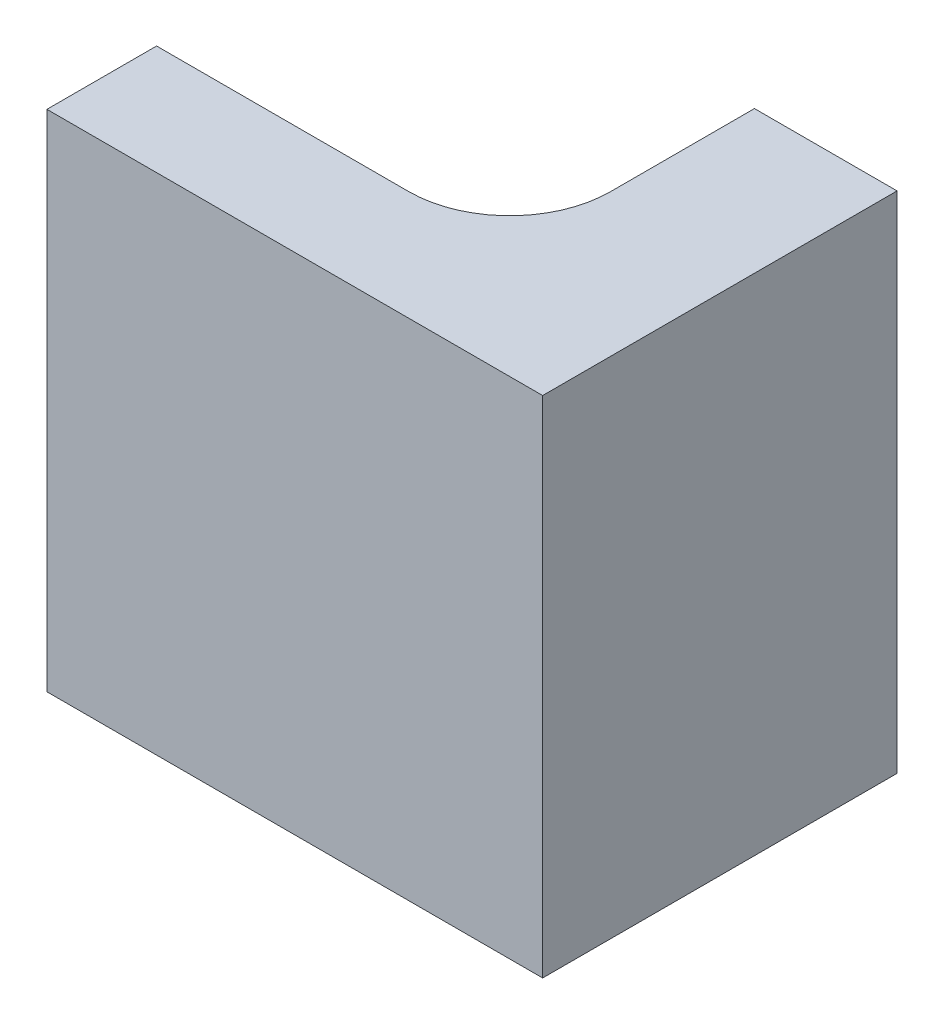
ISO-10303-21;
HEADER;
FILE_DESCRIPTION(('STEP AP214'),'2;1');
FILE_NAME('part.step','',(''),(''),'','','');
FILE_SCHEMA(('AUTOMOTIVE_DESIGN { 1 0 10303 214 1 1 1 1 }'));
ENDSEC;
DATA;
#1=APPLICATION_CONTEXT('core data for automotive mechanical design processes');
#2=APPLICATION_PROTOCOL_DEFINITION('international standard','automotive_design',2000,#1);
#3=PRODUCT_CONTEXT('',#1,'mechanical');
#4=PRODUCT('Part','Part','',(#3));
#5=PRODUCT_RELATED_PRODUCT_CATEGORY('part','',(#4));
#6=PRODUCT_DEFINITION_FORMATION('','',#4);
#7=PRODUCT_DEFINITION_CONTEXT('part definition',#1,'design');
#8=PRODUCT_DEFINITION('design','',#6,#7);
#9=PRODUCT_DEFINITION_SHAPE('','',#8);
#10=(LENGTH_UNIT() NAMED_UNIT(*) SI_UNIT(.MILLI.,.METRE.));
#11=(NAMED_UNIT(*) PLANE_ANGLE_UNIT() SI_UNIT($,.RADIAN.));
#12=(NAMED_UNIT(*) SI_UNIT($,.STERADIAN.) SOLID_ANGLE_UNIT());
#13=UNCERTAINTY_MEASURE_WITH_UNIT(LENGTH_MEASURE(1.E-05),#10,'distance_accuracy_value','');
#14=(GEOMETRIC_REPRESENTATION_CONTEXT(3) GLOBAL_UNCERTAINTY_ASSIGNED_CONTEXT((#13)) GLOBAL_UNIT_ASSIGNED_CONTEXT((#10,
#11,#12)) REPRESENTATION_CONTEXT('',''));
#15=CARTESIAN_POINT('',(0.,0.,0.));
#16=DIRECTION('',(0.,0.,1.));
#17=DIRECTION('',(1.,0.,0.));
#18=AXIS2_PLACEMENT_3D('',#15,#16,#17);
#19=CARTESIAN_POINT('',(0.,50.,-10.8698932293332));
#20=DIRECTION('',(1.,0.,0.));
#21=DIRECTION('',(0.,0.,-1.));
#22=AXIS2_PLACEMENT_3D('',#19,#20,#21);
#23=PLANE('',#22);
#24=DIRECTION('',(0.,0.,1.));
#25=VECTOR('',#24,1.);
#26=CARTESIAN_POINT('',(0.,0.,-10.8698932293332));
#27=LINE('',#26,#25);
#28=CARTESIAN_POINT('',(0.,0.,-10.8698932293332));
#29=VERTEX_POINT('',#28);
#30=CARTESIAN_POINT('',(0.,0.,0.));
#31=VERTEX_POINT('',#30);
#32=EDGE_CURVE('E122',#29,#31,#27,.T.);
#33=ORIENTED_EDGE('',*,*,#32,.T.);
#34=DIRECTION('',(0.,-1.,0.));
#35=VECTOR('',#34,1.);
#36=CARTESIAN_POINT('',(0.,50.,0.));
#37=LINE('',#36,#35);
#38=CARTESIAN_POINT('',(0.,50.,0.));
#39=VERTEX_POINT('',#38);
#40=EDGE_CURVE('E102',#39,#31,#37,.T.);
#41=ORIENTED_EDGE('',*,*,#40,.F.);
#42=DIRECTION('',(0.,0.,1.));
#43=VECTOR('',#42,1.);
#44=CARTESIAN_POINT('',(0.,50.,-10.8698932293332));
#45=LINE('',#44,#43);
#46=CARTESIAN_POINT('',(0.,50.,-10.8698932293332));
#47=VERTEX_POINT('',#46);
#48=EDGE_CURVE('E112',#47,#39,#45,.T.);
#49=ORIENTED_EDGE('',*,*,#48,.F.);
#50=DIRECTION('',(0.,-1.,0.));
#51=VECTOR('',#50,1.);
#52=CARTESIAN_POINT('',(0.,50.,-10.8698932293332));
#53=LINE('',#52,#51);
#54=EDGE_CURVE('E140',#47,#29,#53,.T.);
#55=ORIENTED_EDGE('',*,*,#54,.T.);
#56=EDGE_LOOP('',(#33,#41,#49,#55));
#57=FACE_BOUND('',#56,.T.);
#58=ADVANCED_FACE('F41',(#57),#23,.F.);
#59=CARTESIAN_POINT('',(0.,50.,0.));
#60=DIRECTION('',(0.,0.,-1.));
#61=DIRECTION('',(-1.,0.,0.));
#62=AXIS2_PLACEMENT_3D('',#59,#60,#61);
#63=PLANE('',#62);
#64=DIRECTION('',(1.,0.,0.));
#65=VECTOR('',#64,1.);
#66=CARTESIAN_POINT('',(0.,0.,0.));
#67=LINE('',#66,#65);
#68=CARTESIAN_POINT('',(49.1370117000192,0.,0.));
#69=VERTEX_POINT('',#68);
#70=EDGE_CURVE('E148',#31,#69,#67,.T.);
#71=ORIENTED_EDGE('',*,*,#70,.T.);
#72=DIRECTION('',(0.,-1.,0.));
#73=VECTOR('',#72,1.);
#74=CARTESIAN_POINT('',(49.1370117000192,50.,0.));
#75=LINE('',#74,#73);
#76=CARTESIAN_POINT('',(49.1370117000192,50.,0.));
#77=VERTEX_POINT('',#76);
#78=EDGE_CURVE('E110',#77,#69,#75,.T.);
#79=ORIENTED_EDGE('',*,*,#78,.F.);
#80=DIRECTION('',(1.,0.,0.));
#81=VECTOR('',#80,1.);
#82=CARTESIAN_POINT('',(0.,50.,0.));
#83=LINE('',#82,#81);
#84=EDGE_CURVE('E99',#39,#77,#83,.T.);
#85=ORIENTED_EDGE('',*,*,#84,.F.);
#86=ORIENTED_EDGE('',*,*,#40,.T.);
#87=EDGE_LOOP('',(#71,#79,#85,#86));
#88=FACE_BOUND('',#87,.T.);
#89=ADVANCED_FACE('F105',(#88),#63,.F.);
#90=CARTESIAN_POINT('',(49.1370117000192,50.,0.));
#91=DIRECTION('',(-1.,0.,0.));
#92=DIRECTION('',(0.,0.,1.));
#93=AXIS2_PLACEMENT_3D('',#90,#91,#92);
#94=PLANE('',#93);
#95=DIRECTION('',(0.,0.,-1.));
#96=VECTOR('',#95,1.);
#97=CARTESIAN_POINT('',(49.1370117000192,0.,0.));
#98=LINE('',#97,#96);
#99=CARTESIAN_POINT('',(49.1370117000192,0.,-35.1302346397289));
#100=VERTEX_POINT('',#99);
#101=EDGE_CURVE('E145',#69,#100,#98,.T.);
#102=ORIENTED_EDGE('',*,*,#101,.T.);
#103=DIRECTION('',(0.,-1.,0.));
#104=VECTOR('',#103,1.);
#105=CARTESIAN_POINT('',(49.1370117000192,50.,-35.1302346397289));
#106=LINE('',#105,#104);
#107=CARTESIAN_POINT('',(49.1370117000192,50.,-35.1302346397289));
#108=VERTEX_POINT('',#107);
#109=EDGE_CURVE('E126',#108,#100,#106,.T.);
#110=ORIENTED_EDGE('',*,*,#109,.F.);
#111=DIRECTION('',(0.,0.,-1.));
#112=VECTOR('',#111,1.);
#113=CARTESIAN_POINT('',(49.1370117000192,50.,0.));
#114=LINE('',#113,#112);
#115=EDGE_CURVE('E109',#77,#108,#114,.T.);
#116=ORIENTED_EDGE('',*,*,#115,.F.);
#117=ORIENTED_EDGE('',*,*,#78,.T.);
#118=EDGE_LOOP('',(#102,#110,#116,#117));
#119=FACE_BOUND('',#118,.T.);
#120=ADVANCED_FACE('F158',(#119),#94,.F.);
#121=CARTESIAN_POINT('',(49.1370117000192,50.,-35.1302346397289));
#122=DIRECTION('',(0.,0.,1.));
#123=DIRECTION('',(1.,0.,0.));
#124=AXIS2_PLACEMENT_3D('',#121,#122,#123);
#125=PLANE('',#124);
#126=DIRECTION('',(-1.,0.,0.));
#127=VECTOR('',#126,1.);
#128=CARTESIAN_POINT('',(49.1370117000192,0.,-35.1302346397289));
#129=LINE('',#128,#127);
#130=CARTESIAN_POINT('',(35.,0.,-35.1302346397289));
#131=VERTEX_POINT('',#130);
#132=EDGE_CURVE('E142',#100,#131,#129,.T.);
#133=ORIENTED_EDGE('',*,*,#132,.T.);
#134=DIRECTION('',(0.,-1.,0.));
#135=VECTOR('',#134,1.);
#136=CARTESIAN_POINT('',(35.,50.,-35.1302346397289));
#137=LINE('',#136,#135);
#138=CARTESIAN_POINT('',(35.,50.,-35.1302346397289));
#139=VERTEX_POINT('',#138);
#140=EDGE_CURVE('E131',#139,#131,#137,.T.);
#141=ORIENTED_EDGE('',*,*,#140,.F.);
#142=DIRECTION('',(-1.,0.,0.));
#143=VECTOR('',#142,1.);
#144=CARTESIAN_POINT('',(49.1370117000192,50.,-35.1302346397289));
#145=LINE('',#144,#143);
#146=EDGE_CURVE('E155',#108,#139,#145,.T.);
#147=ORIENTED_EDGE('',*,*,#146,.F.);
#148=ORIENTED_EDGE('',*,*,#109,.T.);
#149=EDGE_LOOP('',(#133,#141,#147,#148));
#150=FACE_BOUND('',#149,.T.);
#151=ADVANCED_FACE('F165',(#150),#125,.F.);
#152=CARTESIAN_POINT('',(35.,50.,-35.1302346397289));
#153=DIRECTION('',(1.,0.,0.));
#154=DIRECTION('',(0.,0.,-1.));
#155=AXIS2_PLACEMENT_3D('',#152,#153,#154);
#156=PLANE('',#155);
#157=DIRECTION('',(0.,0.,1.));
#158=VECTOR('',#157,1.);
#159=CARTESIAN_POINT('',(35.,0.,-35.1302346397289));
#160=LINE('',#159,#158);
#161=CARTESIAN_POINT('',(35.,0.,-20.8698932293332));
#162=VERTEX_POINT('',#161);
#163=EDGE_CURVE('E139',#131,#162,#160,.T.);
#164=ORIENTED_EDGE('',*,*,#163,.T.);
#165=DIRECTION('',(0.,-1.,0.));
#166=VECTOR('',#165,1.);
#167=CARTESIAN_POINT('',(35.,50.,-20.8698932293332));
#168=LINE('',#167,#166);
#169=CARTESIAN_POINT('',(35.,50.,-20.8698932293332));
#170=VERTEX_POINT('',#169);
#171=EDGE_CURVE('E57',#162,#170,#168,.F.);
#172=ORIENTED_EDGE('',*,*,#171,.T.);
#173=DIRECTION('',(0.,0.,1.));
#174=VECTOR('',#173,1.);
#175=CARTESIAN_POINT('',(35.,50.,-35.1302346397289));
#176=LINE('',#175,#174);
#177=EDGE_CURVE('E147',#139,#170,#176,.T.);
#178=ORIENTED_EDGE('',*,*,#177,.F.);
#179=ORIENTED_EDGE('',*,*,#140,.T.);
#180=EDGE_LOOP('',(#164,#172,#178,#179));
#181=FACE_BOUND('',#180,.T.);
#182=ADVANCED_FACE('F162',(#181),#156,.F.);
#183=CARTESIAN_POINT('',(35.,50.,-10.8698932293332));
#184=DIRECTION('',(0.,0.,1.));
#185=DIRECTION('',(1.,0.,0.));
#186=AXIS2_PLACEMENT_3D('',#183,#184,#185);
#187=PLANE('',#186);
#188=DIRECTION('',(-1.,0.,0.));
#189=VECTOR('',#188,1.);
#190=CARTESIAN_POINT('',(35.,50.,-10.8698932293332));
#191=LINE('',#190,#189);
#192=CARTESIAN_POINT('',(25.,50.,-10.8698932293332));
#193=VERTEX_POINT('',#192);
#194=EDGE_CURVE('E117',#193,#47,#191,.T.);
#195=ORIENTED_EDGE('',*,*,#194,.F.);
#196=DIRECTION('',(0.,-1.,0.));
#197=VECTOR('',#196,1.);
#198=CARTESIAN_POINT('',(25.,0.,-10.8698932293332));
#199=LINE('',#198,#197);
#200=CARTESIAN_POINT('',(25.,0.,-10.8698932293332));
#201=VERTEX_POINT('',#200);
#202=EDGE_CURVE('E123',#193,#201,#199,.T.);
#203=ORIENTED_EDGE('',*,*,#202,.T.);
#204=DIRECTION('',(-1.,0.,0.));
#205=VECTOR('',#204,1.);
#206=CARTESIAN_POINT('',(35.,0.,-10.8698932293332));
#207=LINE('',#206,#205);
#208=EDGE_CURVE('E118',#201,#29,#207,.T.);
#209=ORIENTED_EDGE('',*,*,#208,.T.);
#210=ORIENTED_EDGE('',*,*,#54,.F.);
#211=EDGE_LOOP('',(#195,#203,#209,#210));
#212=FACE_BOUND('',#211,.T.);
#213=ADVANCED_FACE('F169',(#212),#187,.F.);
#214=CARTESIAN_POINT('',(0.,50.,0.));
#215=DIRECTION('',(0.,1.,0.));
#216=DIRECTION('',(0.,0.,1.));
#217=AXIS2_PLACEMENT_3D('',#214,#215,#216);
#218=PLANE('',#217);
#219=ORIENTED_EDGE('',*,*,#48,.T.);
#220=ORIENTED_EDGE('',*,*,#84,.T.);
#221=ORIENTED_EDGE('',*,*,#115,.T.);
#222=ORIENTED_EDGE('',*,*,#146,.T.);
#223=ORIENTED_EDGE('',*,*,#177,.T.);
#224=CARTESIAN_POINT('',(25.,50.,-20.8698932293332));
#225=DIRECTION('',(0.,1.,0.));
#226=DIRECTION('',(0.,0.,1.));
#227=AXIS2_PLACEMENT_3D('',#224,#225,#226);
#228=CIRCLE('',#227,10.);
#229=EDGE_CURVE('E12',#170,#193,#228,.F.);
#230=ORIENTED_EDGE('',*,*,#229,.T.);
#231=ORIENTED_EDGE('',*,*,#194,.T.);
#232=EDGE_LOOP('',(#219,#220,#221,#222,#223,#230,#231));
#233=FACE_BOUND('',#232,.T.);
#234=ADVANCED_FACE('F111',(#233),#218,.T.);
#235=CARTESIAN_POINT('',(0.,0.,0.));
#236=DIRECTION('',(0.,1.,0.));
#237=DIRECTION('',(0.,0.,1.));
#238=AXIS2_PLACEMENT_3D('',#235,#236,#237);
#239=PLANE('',#238);
#240=ORIENTED_EDGE('',*,*,#32,.F.);
#241=ORIENTED_EDGE('',*,*,#208,.F.);
#242=CARTESIAN_POINT('',(25.,0.,-20.8698932293332));
#243=DIRECTION('',(0.,1.,0.));
#244=DIRECTION('',(0.,0.,1.));
#245=AXIS2_PLACEMENT_3D('',#242,#243,#244);
#246=CIRCLE('',#245,10.);
#247=EDGE_CURVE('E47',#201,#162,#246,.T.);
#248=ORIENTED_EDGE('',*,*,#247,.T.);
#249=ORIENTED_EDGE('',*,*,#163,.F.);
#250=ORIENTED_EDGE('',*,*,#132,.F.);
#251=ORIENTED_EDGE('',*,*,#101,.F.);
#252=ORIENTED_EDGE('',*,*,#70,.F.);
#253=EDGE_LOOP('',(#240,#241,#248,#249,#250,#251,#252));
#254=FACE_BOUND('',#253,.T.);
#255=ADVANCED_FACE('F166',(#254),#239,.F.);
#256=CARTESIAN_POINT('',(25.,50.,-20.8698932293332));
#257=DIRECTION('',(0.,1.,0.));
#258=DIRECTION('',(0.,0.,1.));
#259=AXIS2_PLACEMENT_3D('',#256,#257,#258);
#260=CYLINDRICAL_SURFACE('',#259,10.);
#261=ORIENTED_EDGE('',*,*,#229,.F.);
#262=ORIENTED_EDGE('',*,*,#171,.F.);
#263=ORIENTED_EDGE('',*,*,#247,.F.);
#264=ORIENTED_EDGE('',*,*,#202,.F.);
#265=EDGE_LOOP('',(#261,#262,#263,#264));
#266=FACE_BOUND('',#265,.T.);
#267=ADVANCED_FACE('F43',(#266),#260,.F.);
#268=CLOSED_SHELL('',(#58,#89,#120,#151,#182,#213,#234,#255,#267));
#269=MANIFOLD_SOLID_BREP('B2',#268);
#270=ADVANCED_BREP_SHAPE_REPRESENTATION('',(#18,#269),#14);
#271=SHAPE_DEFINITION_REPRESENTATION(#9,#270);
ENDSEC;
END-ISO-10303-21;
